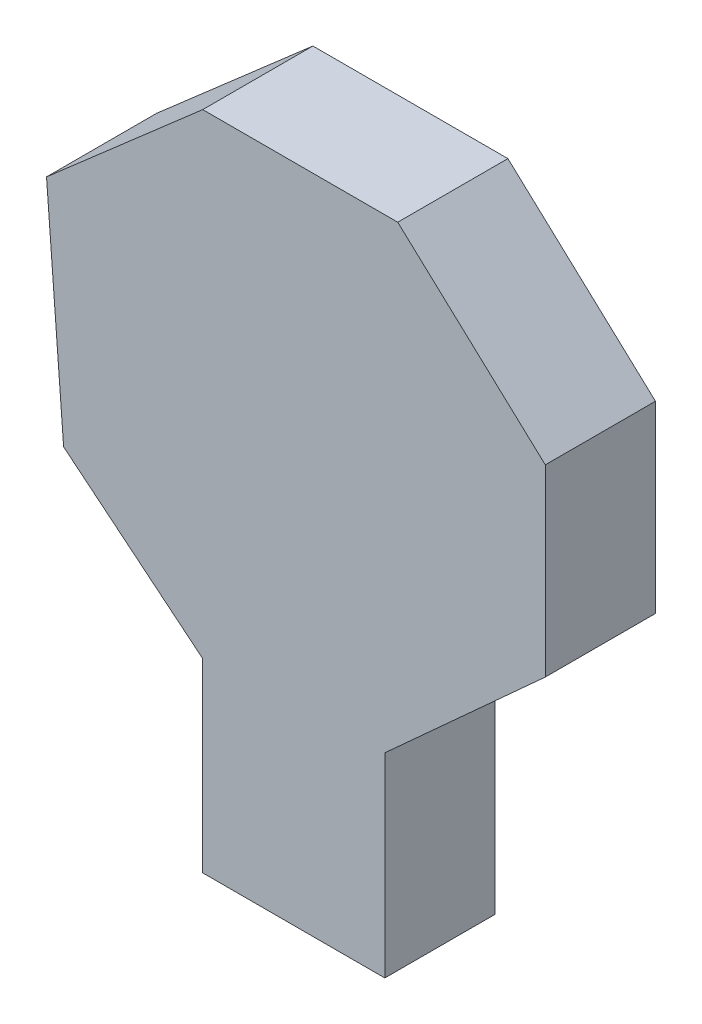
ISO-10303-21;
HEADER;
FILE_DESCRIPTION(('STEP AP214'),'2;1');
FILE_NAME('part.step','',(''),(''),'','','');
FILE_SCHEMA(('AUTOMOTIVE_DESIGN { 1 0 10303 214 1 1 1 1 }'));
ENDSEC;
DATA;
#1=APPLICATION_CONTEXT('core data for automotive mechanical design processes');
#2=APPLICATION_PROTOCOL_DEFINITION('international standard','automotive_design',2000,#1);
#3=PRODUCT_CONTEXT('',#1,'mechanical');
#4=PRODUCT('Part','Part','',(#3));
#5=PRODUCT_RELATED_PRODUCT_CATEGORY('part','',(#4));
#6=PRODUCT_DEFINITION_FORMATION('','',#4);
#7=PRODUCT_DEFINITION_CONTEXT('part definition',#1,'design');
#8=PRODUCT_DEFINITION('design','',#6,#7);
#9=PRODUCT_DEFINITION_SHAPE('','',#8);
#10=(LENGTH_UNIT() NAMED_UNIT(*) SI_UNIT(.MILLI.,.METRE.));
#11=(NAMED_UNIT(*) PLANE_ANGLE_UNIT() SI_UNIT($,.RADIAN.));
#12=(NAMED_UNIT(*) SI_UNIT($,.STERADIAN.) SOLID_ANGLE_UNIT());
#13=UNCERTAINTY_MEASURE_WITH_UNIT(LENGTH_MEASURE(1.E-05),#10,'distance_accuracy_value','');
#14=(GEOMETRIC_REPRESENTATION_CONTEXT(3) GLOBAL_UNCERTAINTY_ASSIGNED_CONTEXT((#13)) GLOBAL_UNIT_ASSIGNED_CONTEXT((#10,
#11,#12)) REPRESENTATION_CONTEXT('',''));
#15=CARTESIAN_POINT('',(0.,0.,0.));
#16=DIRECTION('',(0.,0.,1.));
#17=DIRECTION('',(1.,0.,0.));
#18=AXIS2_PLACEMENT_3D('',#15,#16,#17);
#19=CARTESIAN_POINT('',(-21.0464135884876,9.47387769523058,10.));
#20=DIRECTION('',(0.633424761415685,0.773804285091187,0.));
#21=DIRECTION('',(-0.773804285091187,0.633424761415685,0.));
#22=AXIS2_PLACEMENT_3D('',#19,#20,#21);
#23=PLANE('',#22);
#24=DIRECTION('',(0.773804285091187,-0.633424761415685,0.));
#25=VECTOR('',#24,1.);
#26=CARTESIAN_POINT('',(-21.0464135884876,9.47387769523058,0.));
#27=LINE('',#26,#25);
#28=CARTESIAN_POINT('',(-21.0464135884876,9.47387769523058,0.));
#29=VERTEX_POINT('',#28);
#30=CARTESIAN_POINT('',(-8.42036553524804,-0.861618798955616,0.));
#31=VERTEX_POINT('',#30);
#32=EDGE_CURVE('E158',#29,#31,#27,.T.);
#33=ORIENTED_EDGE('',*,*,#32,.T.);
#34=DIRECTION('',(0.,0.,-1.));
#35=VECTOR('',#34,1.);
#36=CARTESIAN_POINT('',(-8.42036553524804,-0.861618798955616,10.));
#37=LINE('',#36,#35);
#38=CARTESIAN_POINT('',(-8.42036553524804,-0.861618798955616,10.));
#39=VERTEX_POINT('',#38);
#40=EDGE_CURVE('E11',#39,#31,#37,.T.);
#41=ORIENTED_EDGE('',*,*,#40,.F.);
#42=DIRECTION('',(0.773804285091187,-0.633424761415685,0.));
#43=VECTOR('',#42,1.);
#44=CARTESIAN_POINT('',(-21.0464135884876,9.47387769523058,10.));
#45=LINE('',#44,#43);
#46=CARTESIAN_POINT('',(-21.0464135884876,9.47387769523058,10.));
#47=VERTEX_POINT('',#46);
#48=EDGE_CURVE('E186',#47,#39,#45,.T.);
#49=ORIENTED_EDGE('',*,*,#48,.F.);
#50=DIRECTION('',(0.,0.,-1.));
#51=VECTOR('',#50,1.);
#52=CARTESIAN_POINT('',(-21.0464135884876,9.47387769523058,10.));
#53=LINE('',#52,#51);
#54=EDGE_CURVE('E154',#47,#29,#53,.T.);
#55=ORIENTED_EDGE('',*,*,#54,.T.);
#56=EDGE_LOOP('',(#33,#41,#49,#55));
#57=FACE_BOUND('',#56,.T.);
#58=ADVANCED_FACE('F45',(#57),#23,.F.);
#59=CARTESIAN_POINT('',(-8.42036553524804,-0.861618798955616,10.));
#60=DIRECTION('',(1.,0.,0.));
#61=DIRECTION('',(0.,0.,-1.));
#62=AXIS2_PLACEMENT_3D('',#59,#60,#61);
#63=PLANE('',#62);
#64=DIRECTION('',(0.,-1.,0.));
#65=VECTOR('',#64,1.);
#66=CARTESIAN_POINT('',(-8.42036553524804,-0.861618798955616,0.));
#67=LINE('',#66,#65);
#68=CARTESIAN_POINT('',(-8.42036553524804,-17.7023498694517,0.));
#69=VERTEX_POINT('',#68);
#70=EDGE_CURVE('E162',#31,#69,#67,.T.);
#71=ORIENTED_EDGE('',*,*,#70,.T.);
#72=DIRECTION('',(0.,0.,-1.));
#73=VECTOR('',#72,1.);
#74=CARTESIAN_POINT('',(-8.42036553524804,-17.7023498694517,10.));
#75=LINE('',#74,#73);
#76=CARTESIAN_POINT('',(-8.42036553524804,-17.7023498694517,10.));
#77=VERTEX_POINT('',#76);
#78=EDGE_CURVE('E54',#77,#69,#75,.T.);
#79=ORIENTED_EDGE('',*,*,#78,.F.);
#80=DIRECTION('',(0.,-1.,0.));
#81=VECTOR('',#80,1.);
#82=CARTESIAN_POINT('',(-8.42036553524804,-0.861618798955616,10.));
#83=LINE('',#82,#81);
#84=EDGE_CURVE('E111',#39,#77,#83,.T.);
#85=ORIENTED_EDGE('',*,*,#84,.F.);
#86=ORIENTED_EDGE('',*,*,#40,.T.);
#87=EDGE_LOOP('',(#71,#79,#85,#86));
#88=FACE_BOUND('',#87,.T.);
#89=ADVANCED_FACE('F250',(#88),#63,.F.);
#90=CARTESIAN_POINT('',(-8.42036553524804,-17.7023498694517,10.));
#91=DIRECTION('',(0.,1.,0.));
#92=DIRECTION('',(0.,0.,1.));
#93=AXIS2_PLACEMENT_3D('',#90,#91,#92);
#94=PLANE('',#93);
#95=DIRECTION('',(1.,0.,0.));
#96=VECTOR('',#95,1.);
#97=CARTESIAN_POINT('',(-8.42036553524804,-17.7023498694517,0.));
#98=LINE('',#97,#96);
#99=CARTESIAN_POINT('',(8.10704960835509,-17.7023498694517,0.));
#100=VERTEX_POINT('',#99);
#101=EDGE_CURVE('E165',#69,#100,#98,.T.);
#102=ORIENTED_EDGE('',*,*,#101,.T.);
#103=DIRECTION('',(0.,0.,-1.));
#104=VECTOR('',#103,1.);
#105=CARTESIAN_POINT('',(8.10704960835509,-17.7023498694517,10.));
#106=LINE('',#105,#104);
#107=CARTESIAN_POINT('',(8.10704960835509,-17.7023498694517,10.));
#108=VERTEX_POINT('',#107);
#109=EDGE_CURVE('E205',#108,#100,#106,.T.);
#110=ORIENTED_EDGE('',*,*,#109,.F.);
#111=DIRECTION('',(1.,0.,0.));
#112=VECTOR('',#111,1.);
#113=CARTESIAN_POINT('',(-8.42036553524804,-17.7023498694517,10.));
#114=LINE('',#113,#112);
#115=EDGE_CURVE('E215',#77,#108,#114,.T.);
#116=ORIENTED_EDGE('',*,*,#115,.F.);
#117=ORIENTED_EDGE('',*,*,#78,.T.);
#118=EDGE_LOOP('',(#102,#110,#116,#117));
#119=FACE_BOUND('',#118,.T.);
#120=ADVANCED_FACE('F213',(#119),#94,.F.);
#121=CARTESIAN_POINT('',(8.10704960835509,-17.7023498694517,10.));
#122=DIRECTION('',(-1.,0.,0.));
#123=DIRECTION('',(0.,0.,1.));
#124=AXIS2_PLACEMENT_3D('',#121,#122,#123);
#125=PLANE('',#124);
#126=DIRECTION('',(0.,1.,0.));
#127=VECTOR('',#126,1.);
#128=CARTESIAN_POINT('',(8.10704960835509,-17.7023498694517,0.));
#129=LINE('',#128,#127);
#130=CARTESIAN_POINT('',(8.10704960835509,0.,0.));
#131=VERTEX_POINT('',#130);
#132=EDGE_CURVE('E168',#100,#131,#129,.T.);
#133=ORIENTED_EDGE('',*,*,#132,.T.);
#134=DIRECTION('',(0.,0.,-1.));
#135=VECTOR('',#134,1.);
#136=CARTESIAN_POINT('',(8.10704960835509,0.,10.));
#137=LINE('',#136,#135);
#138=CARTESIAN_POINT('',(8.10704960835509,0.,10.));
#139=VERTEX_POINT('',#138);
#140=EDGE_CURVE('E201',#139,#131,#137,.T.);
#141=ORIENTED_EDGE('',*,*,#140,.F.);
#142=DIRECTION('',(0.,1.,0.));
#143=VECTOR('',#142,1.);
#144=CARTESIAN_POINT('',(8.10704960835509,-17.7023498694517,10.));
#145=LINE('',#144,#143);
#146=EDGE_CURVE('E234',#108,#139,#145,.T.);
#147=ORIENTED_EDGE('',*,*,#146,.F.);
#148=ORIENTED_EDGE('',*,*,#109,.T.);
#149=EDGE_LOOP('',(#133,#141,#147,#148));
#150=FACE_BOUND('',#149,.T.);
#151=ADVANCED_FACE('F224',(#150),#125,.F.);
#152=CARTESIAN_POINT('',(8.10704960835509,0.,10.));
#153=DIRECTION('',(-0.672474713141739,0.740120098487358,0.));
#154=DIRECTION('',(-0.740120098487358,-0.672474713141739,0.));
#155=AXIS2_PLACEMENT_3D('',#152,#153,#154);
#156=PLANE('',#155);
#157=DIRECTION('',(0.740120098487358,0.672474713141739,0.));
#158=VECTOR('',#157,1.);
#159=CARTESIAN_POINT('',(8.10704960835509,0.,0.));
#160=LINE('',#159,#158);
#161=CARTESIAN_POINT('',(22.6762402088773,13.2375979112272,0.));
#162=VERTEX_POINT('',#161);
#163=EDGE_CURVE('E171',#131,#162,#160,.T.);
#164=ORIENTED_EDGE('',*,*,#163,.T.);
#165=DIRECTION('',(0.,0.,-1.));
#166=VECTOR('',#165,1.);
#167=CARTESIAN_POINT('',(22.6762402088773,13.2375979112272,10.));
#168=LINE('',#167,#166);
#169=CARTESIAN_POINT('',(22.6762402088773,13.2375979112272,10.));
#170=VERTEX_POINT('',#169);
#171=EDGE_CURVE('E197',#170,#162,#168,.T.);
#172=ORIENTED_EDGE('',*,*,#171,.F.);
#173=DIRECTION('',(0.740120098487358,0.672474713141739,0.));
#174=VECTOR('',#173,1.);
#175=CARTESIAN_POINT('',(8.10704960835509,0.,10.));
#176=LINE('',#175,#174);
#177=EDGE_CURVE('E230',#139,#170,#176,.T.);
#178=ORIENTED_EDGE('',*,*,#177,.F.);
#179=ORIENTED_EDGE('',*,*,#140,.T.);
#180=EDGE_LOOP('',(#164,#172,#178,#179));
#181=FACE_BOUND('',#180,.T.);
#182=ADVANCED_FACE('F228',(#181),#156,.F.);
#183=CARTESIAN_POINT('',(22.6762402088773,13.2375979112272,10.));
#184=DIRECTION('',(-1.,0.,0.));
#185=DIRECTION('',(0.,0.,1.));
#186=AXIS2_PLACEMENT_3D('',#183,#184,#185);
#187=PLANE('',#186);
#188=DIRECTION('',(0.,1.,0.));
#189=VECTOR('',#188,1.);
#190=CARTESIAN_POINT('',(22.6762402088773,13.2375979112272,0.));
#191=LINE('',#190,#189);
#192=CARTESIAN_POINT('',(22.6762402088773,29.9216710182768,0.));
#193=VERTEX_POINT('',#192);
#194=EDGE_CURVE('E174',#162,#193,#191,.T.);
#195=ORIENTED_EDGE('',*,*,#194,.T.);
#196=DIRECTION('',(0.,0.,-1.));
#197=VECTOR('',#196,1.);
#198=CARTESIAN_POINT('',(22.6762402088773,29.9216710182768,10.));
#199=LINE('',#198,#197);
#200=CARTESIAN_POINT('',(22.6762402088773,29.9216710182768,10.));
#201=VERTEX_POINT('',#200);
#202=EDGE_CURVE('E193',#201,#193,#199,.T.);
#203=ORIENTED_EDGE('',*,*,#202,.F.);
#204=DIRECTION('',(0.,1.,0.));
#205=VECTOR('',#204,1.);
#206=CARTESIAN_POINT('',(22.6762402088773,13.2375979112272,10.));
#207=LINE('',#206,#205);
#208=EDGE_CURVE('E233',#170,#201,#207,.T.);
#209=ORIENTED_EDGE('',*,*,#208,.F.);
#210=ORIENTED_EDGE('',*,*,#171,.T.);
#211=EDGE_LOOP('',(#195,#203,#209,#210));
#212=FACE_BOUND('',#211,.T.);
#213=ADVANCED_FACE('F262',(#212),#187,.F.);
#214=CARTESIAN_POINT('',(22.6762402088773,29.9216710182768,10.));
#215=DIRECTION('',(-0.67863681003434,-0.734474015923242,0.));
#216=DIRECTION('',(0.734474015923242,-0.67863681003434,0.));
#217=AXIS2_PLACEMENT_3D('',#214,#215,#216);
#218=PLANE('',#217);
#219=DIRECTION('',(-0.734474015923242,0.67863681003434,0.));
#220=VECTOR('',#219,1.);
#221=CARTESIAN_POINT('',(22.6762402088773,29.9216710182768,0.));
#222=LINE('',#221,#220);
#223=CARTESIAN_POINT('',(9.28198433420365,42.2976501305483,0.));
#224=VERTEX_POINT('',#223);
#225=EDGE_CURVE('E177',#193,#224,#222,.T.);
#226=ORIENTED_EDGE('',*,*,#225,.T.);
#227=DIRECTION('',(0.,0.,-1.));
#228=VECTOR('',#227,1.);
#229=CARTESIAN_POINT('',(9.28198433420365,42.2976501305483,10.));
#230=LINE('',#229,#228);
#231=CARTESIAN_POINT('',(9.28198433420365,42.2976501305483,10.));
#232=VERTEX_POINT('',#231);
#233=EDGE_CURVE('E147',#232,#224,#230,.T.);
#234=ORIENTED_EDGE('',*,*,#233,.F.);
#235=DIRECTION('',(-0.734474015923242,0.67863681003434,0.));
#236=VECTOR('',#235,1.);
#237=CARTESIAN_POINT('',(22.6762402088773,29.9216710182768,10.));
#238=LINE('',#237,#236);
#239=EDGE_CURVE('E136',#201,#232,#238,.T.);
#240=ORIENTED_EDGE('',*,*,#239,.F.);
#241=ORIENTED_EDGE('',*,*,#202,.T.);
#242=EDGE_LOOP('',(#226,#234,#240,#241));
#243=FACE_BOUND('',#242,.T.);
#244=ADVANCED_FACE('F265',(#243),#218,.F.);
#245=CARTESIAN_POINT('',(9.28198433420365,42.2976501305483,10.));
#246=DIRECTION('',(0.,-1.,0.));
#247=DIRECTION('',(0.,0.,-1.));
#248=AXIS2_PLACEMENT_3D('',#245,#246,#247);
#249=PLANE('',#248);
#250=DIRECTION('',(-1.,0.,0.));
#251=VECTOR('',#250,1.);
#252=CARTESIAN_POINT('',(9.28198433420365,42.2976501305483,0.));
#253=LINE('',#252,#251);
#254=CARTESIAN_POINT('',(-8.42036553524804,42.2976501305483,0.));
#255=VERTEX_POINT('',#254);
#256=EDGE_CURVE('E145',#224,#255,#253,.T.);
#257=ORIENTED_EDGE('',*,*,#256,.T.);
#258=DIRECTION('',(0.,0.,-1.));
#259=VECTOR('',#258,1.);
#260=CARTESIAN_POINT('',(-8.42036553524804,42.2976501305483,10.));
#261=LINE('',#260,#259);
#262=CARTESIAN_POINT('',(-8.42036553524804,42.2976501305483,10.));
#263=VERTEX_POINT('',#262);
#264=EDGE_CURVE('E142',#263,#255,#261,.T.);
#265=ORIENTED_EDGE('',*,*,#264,.F.);
#266=DIRECTION('',(-1.,0.,0.));
#267=VECTOR('',#266,1.);
#268=CARTESIAN_POINT('',(9.28198433420365,42.2976501305483,10.));
#269=LINE('',#268,#267);
#270=EDGE_CURVE('E130',#232,#263,#269,.T.);
#271=ORIENTED_EDGE('',*,*,#270,.F.);
#272=ORIENTED_EDGE('',*,*,#233,.T.);
#273=EDGE_LOOP('',(#257,#265,#271,#272));
#274=FACE_BOUND('',#273,.T.);
#275=ADVANCED_FACE('F143',(#274),#249,.F.);
#276=CARTESIAN_POINT('',(-8.42036553524804,42.2976501305483,10.));
#277=DIRECTION('',(0.657620156508953,-0.753349672962788,0.));
#278=DIRECTION('',(0.753349672962788,0.657620156508953,0.));
#279=AXIS2_PLACEMENT_3D('',#276,#277,#278);
#280=PLANE('',#279);
#281=DIRECTION('',(-0.753349672962788,-0.657620156508953,0.));
#282=VECTOR('',#281,1.);
#283=CARTESIAN_POINT('',(-8.42036553524804,42.2976501305483,0.));
#284=LINE('',#283,#282);
#285=CARTESIAN_POINT('',(-22.597911227154,29.9216710182768,0.));
#286=VERTEX_POINT('',#285);
#287=EDGE_CURVE('E97',#255,#286,#284,.T.);
#288=ORIENTED_EDGE('',*,*,#287,.T.);
#289=DIRECTION('',(0.,0.,-1.));
#290=VECTOR('',#289,1.);
#291=CARTESIAN_POINT('',(-22.597911227154,29.9216710182768,10.));
#292=LINE('',#291,#290);
#293=CARTESIAN_POINT('',(-22.597911227154,29.9216710182768,10.));
#294=VERTEX_POINT('',#293);
#295=EDGE_CURVE('E148',#294,#286,#292,.T.);
#296=ORIENTED_EDGE('',*,*,#295,.F.);
#297=DIRECTION('',(-0.753349672962788,-0.657620156508953,0.));
#298=VECTOR('',#297,1.);
#299=CARTESIAN_POINT('',(-8.42036553524804,42.2976501305483,10.));
#300=LINE('',#299,#298);
#301=EDGE_CURVE('E134',#263,#294,#300,.T.);
#302=ORIENTED_EDGE('',*,*,#301,.F.);
#303=ORIENTED_EDGE('',*,*,#264,.T.);
#304=EDGE_LOOP('',(#288,#296,#302,#303));
#305=FACE_BOUND('',#304,.T.);
#306=ADVANCED_FACE('F150',(#305),#280,.F.);
#307=CARTESIAN_POINT('',(-22.597911227154,29.9216710182768,10.));
#308=DIRECTION('',(0.997133783135507,0.0756585654758982,0.));
#309=DIRECTION('',(-0.0756585654758982,0.997133783135507,0.));
#310=AXIS2_PLACEMENT_3D('',#307,#308,#309);
#311=PLANE('',#310);
#312=DIRECTION('',(0.0756585654758982,-0.997133783135507,0.));
#313=VECTOR('',#312,1.);
#314=CARTESIAN_POINT('',(-22.597911227154,29.9216710182768,0.));
#315=LINE('',#314,#313);
#316=EDGE_CURVE('E103',#286,#29,#315,.T.);
#317=ORIENTED_EDGE('',*,*,#316,.T.);
#318=ORIENTED_EDGE('',*,*,#54,.F.);
#319=DIRECTION('',(0.0756585654758982,-0.997133783135507,0.));
#320=VECTOR('',#319,1.);
#321=CARTESIAN_POINT('',(-22.597911227154,29.9216710182768,10.));
#322=LINE('',#321,#320);
#323=EDGE_CURVE('E62',#294,#47,#322,.T.);
#324=ORIENTED_EDGE('',*,*,#323,.F.);
#325=ORIENTED_EDGE('',*,*,#295,.T.);
#326=EDGE_LOOP('',(#317,#318,#324,#325));
#327=FACE_BOUND('',#326,.T.);
#328=ADVANCED_FACE('F274',(#327),#311,.F.);
#329=CARTESIAN_POINT('',(0.,0.,10.));
#330=DIRECTION('',(0.,0.,1.));
#331=DIRECTION('',(1.,0.,0.));
#332=AXIS2_PLACEMENT_3D('',#329,#330,#331);
#333=PLANE('',#332);
#334=ORIENTED_EDGE('',*,*,#48,.T.);
#335=ORIENTED_EDGE('',*,*,#84,.T.);
#336=ORIENTED_EDGE('',*,*,#115,.T.);
#337=ORIENTED_EDGE('',*,*,#146,.T.);
#338=ORIENTED_EDGE('',*,*,#177,.T.);
#339=ORIENTED_EDGE('',*,*,#208,.T.);
#340=ORIENTED_EDGE('',*,*,#239,.T.);
#341=ORIENTED_EDGE('',*,*,#270,.T.);
#342=ORIENTED_EDGE('',*,*,#301,.T.);
#343=ORIENTED_EDGE('',*,*,#323,.T.);
#344=EDGE_LOOP('',(#334,#335,#336,#337,#338,#339,#340,#341,#342,#343));
#345=FACE_BOUND('',#344,.T.);
#346=ADVANCED_FACE('F132',(#345),#333,.T.);
#347=CARTESIAN_POINT('',(0.,0.,0.));
#348=DIRECTION('',(0.,0.,1.));
#349=DIRECTION('',(1.,0.,0.));
#350=AXIS2_PLACEMENT_3D('',#347,#348,#349);
#351=PLANE('',#350);
#352=ORIENTED_EDGE('',*,*,#32,.F.);
#353=ORIENTED_EDGE('',*,*,#316,.F.);
#354=ORIENTED_EDGE('',*,*,#287,.F.);
#355=ORIENTED_EDGE('',*,*,#256,.F.);
#356=ORIENTED_EDGE('',*,*,#225,.F.);
#357=ORIENTED_EDGE('',*,*,#194,.F.);
#358=ORIENTED_EDGE('',*,*,#163,.F.);
#359=ORIENTED_EDGE('',*,*,#132,.F.);
#360=ORIENTED_EDGE('',*,*,#101,.F.);
#361=ORIENTED_EDGE('',*,*,#70,.F.);
#362=EDGE_LOOP('',(#352,#353,#354,#355,#356,#357,#358,#359,#360,#361));
#363=FACE_BOUND('',#362,.T.);
#364=ADVANCED_FACE('F219',(#363),#351,.F.);
#365=CLOSED_SHELL('',(#58,#89,#120,#151,#182,#213,#244,#275,#306,#328,#346,#364));
#366=MANIFOLD_SOLID_BREP('B2',#365);
#367=ADVANCED_BREP_SHAPE_REPRESENTATION('',(#18,#366),#14);
#368=SHAPE_DEFINITION_REPRESENTATION(#9,#367);
ENDSEC;
END-ISO-10303-21;
